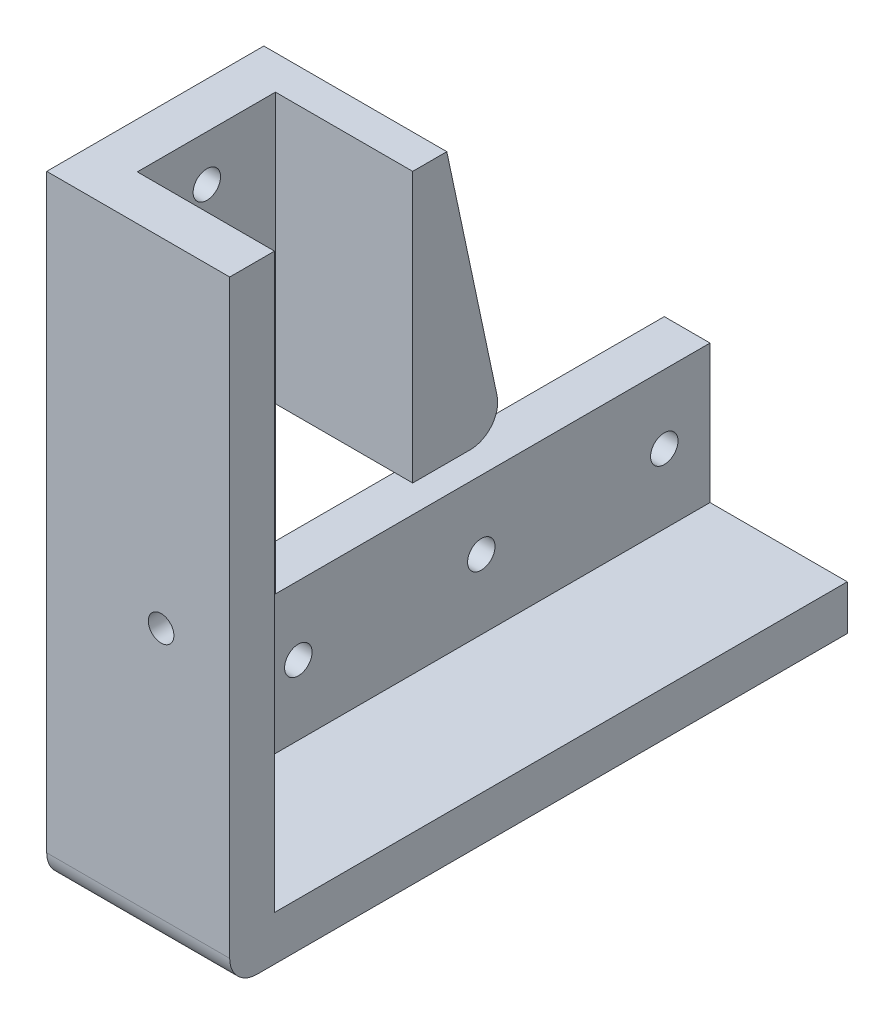
ISO-10303-21;
HEADER;
FILE_DESCRIPTION(('STEP AP214'),'2;1');
FILE_NAME('part.step','',(''),(''),'','','');
FILE_SCHEMA(('AUTOMOTIVE_DESIGN { 1 0 10303 214 1 1 1 1 }'));
ENDSEC;
DATA;
#1=APPLICATION_CONTEXT('core data for automotive mechanical design processes');
#2=APPLICATION_PROTOCOL_DEFINITION('international standard','automotive_design',2000,#1);
#3=PRODUCT_CONTEXT('',#1,'mechanical');
#4=PRODUCT('Part','Part','',(#3));
#5=PRODUCT_RELATED_PRODUCT_CATEGORY('part','',(#4));
#6=PRODUCT_DEFINITION_FORMATION('','',#4);
#7=PRODUCT_DEFINITION_CONTEXT('part definition',#1,'design');
#8=PRODUCT_DEFINITION('design','',#6,#7);
#9=PRODUCT_DEFINITION_SHAPE('','',#8);
#10=(LENGTH_UNIT() NAMED_UNIT(*) SI_UNIT(.MILLI.,.METRE.));
#11=(NAMED_UNIT(*) PLANE_ANGLE_UNIT() SI_UNIT($,.RADIAN.));
#12=(NAMED_UNIT(*) SI_UNIT($,.STERADIAN.) SOLID_ANGLE_UNIT());
#13=UNCERTAINTY_MEASURE_WITH_UNIT(LENGTH_MEASURE(1.E-05),#10,'distance_accuracy_value','');
#14=(GEOMETRIC_REPRESENTATION_CONTEXT(3) GLOBAL_UNCERTAINTY_ASSIGNED_CONTEXT((#13)) GLOBAL_UNIT_ASSIGNED_CONTEXT((#10,
#11,#12)) REPRESENTATION_CONTEXT('',''));
#15=CARTESIAN_POINT('',(0.,0.,0.));
#16=DIRECTION('',(0.,0.,1.));
#17=DIRECTION('',(1.,0.,0.));
#18=AXIS2_PLACEMENT_3D('',#15,#16,#17);
#19=CARTESIAN_POINT('',(20.,0.,0.));
#20=DIRECTION('',(-1.,0.,0.));
#21=DIRECTION('',(0.,0.,1.));
#22=AXIS2_PLACEMENT_3D('',#19,#20,#21);
#23=PLANE('',#22);
#24=DIRECTION('',(0.,0.,-1.));
#25=VECTOR('',#24,1.);
#26=CARTESIAN_POINT('',(20.,25.5,-7.5));
#27=LINE('',#26,#25);
#28=CARTESIAN_POINT('',(20.,25.5,-7.5));
#29=VERTEX_POINT('',#28);
#30=CARTESIAN_POINT('',(20.,25.5,-13.7953085303948));
#31=VERTEX_POINT('',#30);
#32=EDGE_CURVE('E225',#29,#31,#27,.T.);
#33=ORIENTED_EDGE('',*,*,#32,.T.);
#34=CARTESIAN_POINT('',(20.,28.5,-13.7953085303948));
#35=DIRECTION('',(-1.,0.,0.));
#36=DIRECTION('',(0.,0.,1.));
#37=AXIS2_PLACEMENT_3D('',#34,#35,#36);
#38=CIRCLE('',#37,3.);
#39=CARTESIAN_POINT('',(20.,29.1237350724533,-16.7297513325963));
#40=VERTEX_POINT('',#39);
#41=EDGE_CURVE('E287',#31,#40,#38,.F.);
#42=ORIENTED_EDGE('',*,*,#41,.T.);
#43=DIRECTION('',(0.,0.978147600733806,0.20791169081776));
#44=VECTOR('',#43,1.);
#45=CARTESIAN_POINT('',(20.,25.5,-17.5));
#46=LINE('',#45,#44);
#47=CARTESIAN_POINT('',(20.,55.,-11.2295814307343));
#48=VERTEX_POINT('',#47);
#49=EDGE_CURVE('E228',#40,#48,#46,.T.);
#50=ORIENTED_EDGE('',*,*,#49,.T.);
#51=DIRECTION('',(0.,0.,1.));
#52=VECTOR('',#51,1.);
#53=CARTESIAN_POINT('',(20.,55.,-11.2295814307343));
#54=LINE('',#53,#52);
#55=CARTESIAN_POINT('',(20.,55.,-7.5));
#56=VERTEX_POINT('',#55);
#57=EDGE_CURVE('E232',#48,#56,#54,.T.);
#58=ORIENTED_EDGE('',*,*,#57,.T.);
#59=DIRECTION('',(0.,-1.,0.));
#60=VECTOR('',#59,1.);
#61=CARTESIAN_POINT('',(20.,7.5,-7.5));
#62=LINE('',#61,#60);
#63=EDGE_CURVE('E154',#56,#29,#62,.T.);
#64=ORIENTED_EDGE('',*,*,#63,.T.);
#65=EDGE_LOOP('',(#33,#42,#50,#58,#64));
#66=FACE_BOUND('',#65,.T.);
#67=ADVANCED_FACE('F34',(#66),#23,.F.);
#68=DIRECTION('',(0.,-1.,0.));
#69=VECTOR('',#68,1.);
#70=CARTESIAN_POINT('',(20.,-12.5,12.5));
#71=LINE('',#70,#69);
#72=CARTESIAN_POINT('',(20.,55.,12.5));
#73=VERTEX_POINT('',#72);
#74=CARTESIAN_POINT('',(20.,-9.5,12.5));
#75=VERTEX_POINT('',#74);
#76=EDGE_CURVE('E234',#73,#75,#71,.T.);
#77=ORIENTED_EDGE('',*,*,#76,.T.);
#78=CARTESIAN_POINT('',(20.,-9.5,9.5));
#79=DIRECTION('',(-1.,0.,0.));
#80=DIRECTION('',(0.,0.,1.));
#81=AXIS2_PLACEMENT_3D('',#78,#79,#80);
#82=CIRCLE('',#81,3.);
#83=CARTESIAN_POINT('',(20.,-12.5,9.5));
#84=VERTEX_POINT('',#83);
#85=EDGE_CURVE('E11',#75,#84,#82,.F.);
#86=ORIENTED_EDGE('',*,*,#85,.T.);
#87=DIRECTION('',(0.,0.,-1.));
#88=VECTOR('',#87,1.);
#89=CARTESIAN_POINT('',(20.,-12.5,12.5));
#90=LINE('',#89,#88);
#91=CARTESIAN_POINT('',(20.,-12.5,-55.));
#92=VERTEX_POINT('',#91);
#93=EDGE_CURVE('E236',#84,#92,#90,.T.);
#94=ORIENTED_EDGE('',*,*,#93,.T.);
#95=DIRECTION('',(0.,1.,0.));
#96=VECTOR('',#95,1.);
#97=CARTESIAN_POINT('',(20.,-12.5,-55.));
#98=LINE('',#97,#96);
#99=CARTESIAN_POINT('',(20.,-7.6,-55.));
#100=VERTEX_POINT('',#99);
#101=EDGE_CURVE('E238',#92,#100,#98,.T.);
#102=ORIENTED_EDGE('',*,*,#101,.T.);
#103=DIRECTION('',(0.,0.,1.));
#104=VECTOR('',#103,1.);
#105=CARTESIAN_POINT('',(20.,-7.59999999999999,7.60000000000001));
#106=LINE('',#105,#104);
#107=CARTESIAN_POINT('',(20.,-7.59999999999999,7.60000000000001));
#108=VERTEX_POINT('',#107);
#109=EDGE_CURVE('E167',#100,#108,#106,.T.);
#110=ORIENTED_EDGE('',*,*,#109,.T.);
#111=DIRECTION('',(0.,1.,0.));
#112=VECTOR('',#111,1.);
#113=CARTESIAN_POINT('',(20.,55.,7.6));
#114=LINE('',#113,#112);
#115=CARTESIAN_POINT('',(20.,55.,7.6));
#116=VERTEX_POINT('',#115);
#117=EDGE_CURVE('E164',#108,#116,#114,.T.);
#118=ORIENTED_EDGE('',*,*,#117,.T.);
#119=EDGE_CURVE('E231',#116,#73,#54,.T.);
#120=ORIENTED_EDGE('',*,*,#119,.T.);
#121=EDGE_LOOP('',(#77,#86,#94,#102,#110,#118,#120));
#122=FACE_BOUND('',#121,.T.);
#123=ADVANCED_FACE('F309',(#122),#23,.F.);
#124=CARTESIAN_POINT('',(20.,7.5,-7.5));
#125=DIRECTION('',(0.,0.,1.));
#126=DIRECTION('',(1.,0.,0.));
#127=AXIS2_PLACEMENT_3D('',#124,#125,#126);
#128=PLANE('',#127);
#129=DIRECTION('',(0.,-1.,0.));
#130=VECTOR('',#129,1.);
#131=CARTESIAN_POINT('',(5.,7.5,-7.5));
#132=LINE('',#131,#130);
#133=CARTESIAN_POINT('',(5.,25.5,-7.5));
#134=VERTEX_POINT('',#133);
#135=CARTESIAN_POINT('',(5.,7.5,-7.5));
#136=VERTEX_POINT('',#135);
#137=EDGE_CURVE('E145',#134,#136,#132,.T.);
#138=ORIENTED_EDGE('',*,*,#137,.T.);
#139=DIRECTION('',(-1.,0.,0.));
#140=VECTOR('',#139,1.);
#141=CARTESIAN_POINT('',(20.,7.5,-7.5));
#142=LINE('',#141,#140);
#143=CARTESIAN_POINT('',(0.,7.5,-7.5));
#144=VERTEX_POINT('',#143);
#145=EDGE_CURVE('E241',#136,#144,#142,.T.);
#146=ORIENTED_EDGE('',*,*,#145,.T.);
#147=DIRECTION('',(0.,1.,0.));
#148=VECTOR('',#147,1.);
#149=CARTESIAN_POINT('',(0.,7.5,-7.5));
#150=LINE('',#149,#148);
#151=CARTESIAN_POINT('',(0.,25.5,-7.5));
#152=VERTEX_POINT('',#151);
#153=EDGE_CURVE('E224',#144,#152,#150,.T.);
#154=ORIENTED_EDGE('',*,*,#153,.T.);
#155=DIRECTION('',(-1.,0.,0.));
#156=VECTOR('',#155,1.);
#157=CARTESIAN_POINT('',(20.,25.5,-7.5));
#158=LINE('',#157,#156);
#159=EDGE_CURVE('E272',#134,#152,#158,.T.);
#160=ORIENTED_EDGE('',*,*,#159,.F.);
#161=EDGE_LOOP('',(#138,#146,#154,#160));
#162=FACE_BOUND('',#161,.T.);
#163=ADVANCED_FACE('F321',(#162),#128,.F.);
#164=CARTESIAN_POINT('',(20.,55.,-11.2295814307343));
#165=DIRECTION('',(0.,-1.,0.));
#166=DIRECTION('',(0.,0.,-1.));
#167=AXIS2_PLACEMENT_3D('',#164,#165,#166);
#168=PLANE('',#167);
#169=DIRECTION('',(1.,0.,0.));
#170=VECTOR('',#169,1.);
#171=CARTESIAN_POINT('',(5.,55.,-7.5));
#172=LINE('',#171,#170);
#173=CARTESIAN_POINT('',(5.,55.,-7.5));
#174=VERTEX_POINT('',#173);
#175=EDGE_CURVE('E151',#174,#56,#172,.T.);
#176=ORIENTED_EDGE('',*,*,#175,.T.);
#177=ORIENTED_EDGE('',*,*,#57,.F.);
#178=DIRECTION('',(-1.,0.,0.));
#179=VECTOR('',#178,1.);
#180=CARTESIAN_POINT('',(20.,55.,-11.2295814307343));
#181=LINE('',#180,#179);
#182=CARTESIAN_POINT('',(0.,55.,-11.2295814307343));
#183=VERTEX_POINT('',#182);
#184=EDGE_CURVE('E269',#48,#183,#181,.T.);
#185=ORIENTED_EDGE('',*,*,#184,.T.);
#186=DIRECTION('',(0.,0.,1.));
#187=VECTOR('',#186,1.);
#188=CARTESIAN_POINT('',(0.,55.,-11.2295814307343));
#189=LINE('',#188,#187);
#190=CARTESIAN_POINT('',(0.,55.,12.5));
#191=VERTEX_POINT('',#190);
#192=EDGE_CURVE('E249',#183,#191,#189,.T.);
#193=ORIENTED_EDGE('',*,*,#192,.T.);
#194=DIRECTION('',(-1.,0.,0.));
#195=VECTOR('',#194,1.);
#196=CARTESIAN_POINT('',(20.,55.,12.5));
#197=LINE('',#196,#195);
#198=EDGE_CURVE('E266',#73,#191,#197,.T.);
#199=ORIENTED_EDGE('',*,*,#198,.F.);
#200=ORIENTED_EDGE('',*,*,#119,.F.);
#201=DIRECTION('',(1.,0.,0.));
#202=VECTOR('',#201,1.);
#203=CARTESIAN_POINT('',(5.,55.,7.6));
#204=LINE('',#203,#202);
#205=CARTESIAN_POINT('',(5.,55.,7.6));
#206=VERTEX_POINT('',#205);
#207=EDGE_CURVE('E163',#206,#116,#204,.T.);
#208=ORIENTED_EDGE('',*,*,#207,.F.);
#209=DIRECTION('',(0.,0.,-1.));
#210=VECTOR('',#209,1.);
#211=CARTESIAN_POINT('',(5.,55.,-7.5));
#212=LINE('',#211,#210);
#213=EDGE_CURVE('E142',#206,#174,#212,.T.);
#214=ORIENTED_EDGE('',*,*,#213,.T.);
#215=EDGE_LOOP('',(#176,#177,#185,#193,#199,#200,#208,#214));
#216=FACE_BOUND('',#215,.T.);
#217=ADVANCED_FACE('F161',(#216),#168,.F.);
#218=CARTESIAN_POINT('',(20.,-12.5,-55.));
#219=DIRECTION('',(0.,0.,1.));
#220=DIRECTION('',(1.,0.,0.));
#221=AXIS2_PLACEMENT_3D('',#218,#219,#220);
#222=PLANE('',#221);
#223=DIRECTION('',(1.,0.,0.));
#224=VECTOR('',#223,1.);
#225=CARTESIAN_POINT('',(5.,-7.6,-55.));
#226=LINE('',#225,#224);
#227=CARTESIAN_POINT('',(5.,-7.6,-55.));
#228=VERTEX_POINT('',#227);
#229=EDGE_CURVE('E159',#228,#100,#226,.T.);
#230=ORIENTED_EDGE('',*,*,#229,.T.);
#231=ORIENTED_EDGE('',*,*,#101,.F.);
#232=DIRECTION('',(-1.,0.,0.));
#233=VECTOR('',#232,1.);
#234=CARTESIAN_POINT('',(20.,-12.5,-55.));
#235=LINE('',#234,#233);
#236=CARTESIAN_POINT('',(0.,-12.5,-55.));
#237=VERTEX_POINT('',#236);
#238=EDGE_CURVE('E263',#92,#237,#235,.T.);
#239=ORIENTED_EDGE('',*,*,#238,.T.);
#240=DIRECTION('',(0.,1.,0.));
#241=VECTOR('',#240,1.);
#242=CARTESIAN_POINT('',(0.,-12.5,-55.));
#243=LINE('',#242,#241);
#244=CARTESIAN_POINT('',(0.,7.5,-55.));
#245=VERTEX_POINT('',#244);
#246=EDGE_CURVE('E255',#237,#245,#243,.T.);
#247=ORIENTED_EDGE('',*,*,#246,.T.);
#248=DIRECTION('',(-1.,0.,0.));
#249=VECTOR('',#248,1.);
#250=CARTESIAN_POINT('',(20.,7.5,-55.));
#251=LINE('',#250,#249);
#252=CARTESIAN_POINT('',(5.,7.5,-55.));
#253=VERTEX_POINT('',#252);
#254=EDGE_CURVE('E261',#253,#245,#251,.T.);
#255=ORIENTED_EDGE('',*,*,#254,.F.);
#256=DIRECTION('',(0.,-1.,0.));
#257=VECTOR('',#256,1.);
#258=CARTESIAN_POINT('',(5.,-7.6,-55.));
#259=LINE('',#258,#257);
#260=EDGE_CURVE('E175',#253,#228,#259,.T.);
#261=ORIENTED_EDGE('',*,*,#260,.T.);
#262=EDGE_LOOP('',(#230,#231,#239,#247,#255,#261));
#263=FACE_BOUND('',#262,.T.);
#264=ADVANCED_FACE('F307',(#263),#222,.F.);
#265=CARTESIAN_POINT('',(20.,7.5,-55.));
#266=DIRECTION('',(0.,-1.,0.));
#267=DIRECTION('',(0.,0.,-1.));
#268=AXIS2_PLACEMENT_3D('',#265,#266,#267);
#269=PLANE('',#268);
#270=DIRECTION('',(0.,0.,-1.));
#271=VECTOR('',#270,1.);
#272=CARTESIAN_POINT('',(5.,7.5,-55.));
#273=LINE('',#272,#271);
#274=EDGE_CURVE('E148',#136,#253,#273,.T.);
#275=ORIENTED_EDGE('',*,*,#274,.T.);
#276=ORIENTED_EDGE('',*,*,#254,.T.);
#277=DIRECTION('',(0.,0.,1.));
#278=VECTOR('',#277,1.);
#279=CARTESIAN_POINT('',(0.,7.5,-55.));
#280=LINE('',#279,#278);
#281=EDGE_CURVE('E229',#245,#144,#280,.T.);
#282=ORIENTED_EDGE('',*,*,#281,.T.);
#283=ORIENTED_EDGE('',*,*,#145,.F.);
#284=EDGE_LOOP('',(#275,#276,#282,#283));
#285=FACE_BOUND('',#284,.T.);
#286=ADVANCED_FACE('F319',(#285),#269,.F.);
#287=CARTESIAN_POINT('',(20.,10.,0.));
#288=DIRECTION('',(-1.,0.,0.));
#289=DIRECTION('',(0.,0.,1.));
#290=AXIS2_PLACEMENT_3D('',#287,#288,#289);
#291=CYLINDRICAL_SURFACE('',#290,1.5);
#292=CARTESIAN_POINT('',(0.,10.,0.));
#293=DIRECTION('',(1.,0.,0.));
#294=DIRECTION('',(0.,0.,-1.));
#295=AXIS2_PLACEMENT_3D('',#292,#293,#294);
#296=CIRCLE('',#295,1.5);
#297=CARTESIAN_POINT('',(0.,10.,-1.5));
#298=VERTEX_POINT('',#297);
#299=EDGE_CURVE('E221',#298,#298,#296,.T.);
#300=ORIENTED_EDGE('',*,*,#299,.F.);
#301=EDGE_LOOP('',(#300));
#302=FACE_BOUND('',#301,.T.);
#303=CARTESIAN_POINT('',(5.,10.,0.));
#304=DIRECTION('',(1.,0.,0.));
#305=DIRECTION('',(0.,0.,-1.));
#306=AXIS2_PLACEMENT_3D('',#303,#304,#305);
#307=CIRCLE('',#306,1.5);
#308=CARTESIAN_POINT('',(5.,10.,-1.5));
#309=VERTEX_POINT('',#308);
#310=EDGE_CURVE('E203',#309,#309,#307,.T.);
#311=ORIENTED_EDGE('',*,*,#310,.T.);
#312=EDGE_LOOP('',(#311));
#313=FACE_BOUND('',#312,.T.);
#314=ADVANCED_FACE('F348',(#302,#313),#291,.F.);
#315=CARTESIAN_POINT('',(20.,30.,0.));
#316=DIRECTION('',(-1.,0.,0.));
#317=DIRECTION('',(0.,0.,1.));
#318=AXIS2_PLACEMENT_3D('',#315,#316,#317);
#319=CYLINDRICAL_SURFACE('',#318,1.5);
#320=CARTESIAN_POINT('',(0.,30.,0.));
#321=DIRECTION('',(1.,0.,0.));
#322=DIRECTION('',(0.,0.,-1.));
#323=AXIS2_PLACEMENT_3D('',#320,#321,#322);
#324=CIRCLE('',#323,1.5);
#325=CARTESIAN_POINT('',(0.,30.,-1.5));
#326=VERTEX_POINT('',#325);
#327=EDGE_CURVE('E218',#326,#326,#324,.T.);
#328=ORIENTED_EDGE('',*,*,#327,.F.);
#329=EDGE_LOOP('',(#328));
#330=FACE_BOUND('',#329,.T.);
#331=CARTESIAN_POINT('',(5.,30.,0.));
#332=DIRECTION('',(1.,0.,0.));
#333=DIRECTION('',(0.,0.,-1.));
#334=AXIS2_PLACEMENT_3D('',#331,#332,#333);
#335=CIRCLE('',#334,1.5);
#336=CARTESIAN_POINT('',(5.,30.,-1.5));
#337=VERTEX_POINT('',#336);
#338=EDGE_CURVE('E200',#337,#337,#335,.T.);
#339=ORIENTED_EDGE('',*,*,#338,.T.);
#340=EDGE_LOOP('',(#339));
#341=FACE_BOUND('',#340,.T.);
#342=ADVANCED_FACE('F393',(#330,#341),#319,.F.);
#343=CARTESIAN_POINT('',(20.,0.,-10.));
#344=DIRECTION('',(-1.,0.,0.));
#345=DIRECTION('',(0.,0.,1.));
#346=AXIS2_PLACEMENT_3D('',#343,#344,#345);
#347=CYLINDRICAL_SURFACE('',#346,1.5);
#348=CARTESIAN_POINT('',(0.,0.,-10.));
#349=DIRECTION('',(1.,0.,0.));
#350=DIRECTION('',(0.,0.,-1.));
#351=AXIS2_PLACEMENT_3D('',#348,#349,#350);
#352=CIRCLE('',#351,1.5);
#353=CARTESIAN_POINT('',(0.,0.,-11.5));
#354=VERTEX_POINT('',#353);
#355=EDGE_CURVE('E215',#354,#354,#352,.T.);
#356=ORIENTED_EDGE('',*,*,#355,.F.);
#357=EDGE_LOOP('',(#356));
#358=FACE_BOUND('',#357,.T.);
#359=CARTESIAN_POINT('',(5.,0.,-10.));
#360=DIRECTION('',(1.,0.,0.));
#361=DIRECTION('',(0.,0.,-1.));
#362=AXIS2_PLACEMENT_3D('',#359,#360,#361);
#363=CIRCLE('',#362,1.5);
#364=CARTESIAN_POINT('',(5.,0.,-11.5));
#365=VERTEX_POINT('',#364);
#366=EDGE_CURVE('E197',#365,#365,#363,.T.);
#367=ORIENTED_EDGE('',*,*,#366,.T.);
#368=EDGE_LOOP('',(#367));
#369=FACE_BOUND('',#368,.T.);
#370=ADVANCED_FACE('F400',(#358,#369),#347,.F.);
#371=CARTESIAN_POINT('',(20.,0.,-30.));
#372=DIRECTION('',(-1.,0.,0.));
#373=DIRECTION('',(0.,0.,1.));
#374=AXIS2_PLACEMENT_3D('',#371,#372,#373);
#375=CYLINDRICAL_SURFACE('',#374,1.5);
#376=CARTESIAN_POINT('',(0.,0.,-30.));
#377=DIRECTION('',(1.,0.,0.));
#378=DIRECTION('',(0.,0.,-1.));
#379=AXIS2_PLACEMENT_3D('',#376,#377,#378);
#380=CIRCLE('',#379,1.5);
#381=CARTESIAN_POINT('',(0.,0.,-31.5));
#382=VERTEX_POINT('',#381);
#383=EDGE_CURVE('E212',#382,#382,#380,.T.);
#384=ORIENTED_EDGE('',*,*,#383,.F.);
#385=EDGE_LOOP('',(#384));
#386=FACE_BOUND('',#385,.T.);
#387=CARTESIAN_POINT('',(5.,0.,-30.));
#388=DIRECTION('',(1.,0.,0.));
#389=DIRECTION('',(0.,0.,-1.));
#390=AXIS2_PLACEMENT_3D('',#387,#388,#389);
#391=CIRCLE('',#390,1.5);
#392=CARTESIAN_POINT('',(5.,0.,-31.5));
#393=VERTEX_POINT('',#392);
#394=EDGE_CURVE('E194',#393,#393,#391,.T.);
#395=ORIENTED_EDGE('',*,*,#394,.T.);
#396=EDGE_LOOP('',(#395));
#397=FACE_BOUND('',#396,.T.);
#398=ADVANCED_FACE('F407',(#386,#397),#375,.F.);
#399=CARTESIAN_POINT('',(20.,0.,-50.));
#400=DIRECTION('',(-1.,0.,0.));
#401=DIRECTION('',(0.,0.,1.));
#402=AXIS2_PLACEMENT_3D('',#399,#400,#401);
#403=CYLINDRICAL_SURFACE('',#402,1.5);
#404=CARTESIAN_POINT('',(0.,0.,-50.));
#405=DIRECTION('',(1.,0.,0.));
#406=DIRECTION('',(0.,0.,-1.));
#407=AXIS2_PLACEMENT_3D('',#404,#405,#406);
#408=CIRCLE('',#407,1.5);
#409=CARTESIAN_POINT('',(0.,0.,-51.5));
#410=VERTEX_POINT('',#409);
#411=EDGE_CURVE('E209',#410,#410,#408,.T.);
#412=ORIENTED_EDGE('',*,*,#411,.F.);
#413=EDGE_LOOP('',(#412));
#414=FACE_BOUND('',#413,.T.);
#415=CARTESIAN_POINT('',(5.,0.,-50.));
#416=DIRECTION('',(1.,0.,0.));
#417=DIRECTION('',(0.,0.,-1.));
#418=AXIS2_PLACEMENT_3D('',#415,#416,#417);
#419=CIRCLE('',#418,1.5);
#420=CARTESIAN_POINT('',(5.,0.,-51.5));
#421=VERTEX_POINT('',#420);
#422=EDGE_CURVE('E191',#421,#421,#419,.T.);
#423=ORIENTED_EDGE('',*,*,#422,.T.);
#424=EDGE_LOOP('',(#423));
#425=FACE_BOUND('',#424,.T.);
#426=ADVANCED_FACE('F415',(#414,#425),#403,.F.);
#427=CARTESIAN_POINT('',(20.,50.,0.));
#428=DIRECTION('',(-1.,0.,0.));
#429=DIRECTION('',(0.,0.,1.));
#430=AXIS2_PLACEMENT_3D('',#427,#428,#429);
#431=CYLINDRICAL_SURFACE('',#430,1.5);
#432=CARTESIAN_POINT('',(0.,50.,0.));
#433=DIRECTION('',(1.,0.,0.));
#434=DIRECTION('',(0.,0.,-1.));
#435=AXIS2_PLACEMENT_3D('',#432,#433,#434);
#436=CIRCLE('',#435,1.5);
#437=CARTESIAN_POINT('',(0.,50.,-1.5));
#438=VERTEX_POINT('',#437);
#439=EDGE_CURVE('E206',#438,#438,#436,.T.);
#440=ORIENTED_EDGE('',*,*,#439,.F.);
#441=EDGE_LOOP('',(#440));
#442=FACE_BOUND('',#441,.T.);
#443=CARTESIAN_POINT('',(5.,50.,0.));
#444=DIRECTION('',(1.,0.,0.));
#445=DIRECTION('',(0.,0.,-1.));
#446=AXIS2_PLACEMENT_3D('',#443,#444,#445);
#447=CIRCLE('',#446,1.5);
#448=CARTESIAN_POINT('',(5.,50.,-1.5));
#449=VERTEX_POINT('',#448);
#450=EDGE_CURVE('E158',#449,#449,#447,.T.);
#451=ORIENTED_EDGE('',*,*,#450,.T.);
#452=EDGE_LOOP('',(#451));
#453=FACE_BOUND('',#452,.T.);
#454=ADVANCED_FACE('F352',(#442,#453),#431,.F.);
#455=CARTESIAN_POINT('',(0.,0.,0.));
#456=DIRECTION('',(-1.,0.,0.));
#457=DIRECTION('',(0.,0.,1.));
#458=AXIS2_PLACEMENT_3D('',#455,#456,#457);
#459=PLANE('',#458);
#460=ORIENTED_EDGE('',*,*,#411,.T.);
#461=EDGE_LOOP('',(#460));
#462=FACE_BOUND('',#461,.T.);
#463=ORIENTED_EDGE('',*,*,#355,.T.);
#464=EDGE_LOOP('',(#463));
#465=FACE_BOUND('',#464,.T.);
#466=ORIENTED_EDGE('',*,*,#299,.T.);
#467=EDGE_LOOP('',(#466));
#468=FACE_BOUND('',#467,.T.);
#469=DIRECTION('',(0.,0.978147600733806,0.20791169081776));
#470=VECTOR('',#469,1.);
#471=CARTESIAN_POINT('',(0.,25.5,-17.5));
#472=LINE('',#471,#470);
#473=CARTESIAN_POINT('',(0.,29.1237350724533,-16.7297513325963));
#474=VERTEX_POINT('',#473);
#475=EDGE_CURVE('E247',#474,#183,#472,.T.);
#476=ORIENTED_EDGE('',*,*,#475,.F.);
#477=CARTESIAN_POINT('',(0.,28.5,-13.7953085303948));
#478=DIRECTION('',(-1.,0.,0.));
#479=DIRECTION('',(0.,0.,1.));
#480=AXIS2_PLACEMENT_3D('',#477,#478,#479);
#481=CIRCLE('',#480,3.);
#482=CARTESIAN_POINT('',(0.,25.5,-13.7953085303948));
#483=VERTEX_POINT('',#482);
#484=EDGE_CURVE('E283',#474,#483,#481,.T.);
#485=ORIENTED_EDGE('',*,*,#484,.T.);
#486=DIRECTION('',(0.,0.,-1.));
#487=VECTOR('',#486,1.);
#488=CARTESIAN_POINT('',(0.,25.5,-7.5));
#489=LINE('',#488,#487);
#490=EDGE_CURVE('E244',#152,#483,#489,.T.);
#491=ORIENTED_EDGE('',*,*,#490,.F.);
#492=ORIENTED_EDGE('',*,*,#153,.F.);
#493=ORIENTED_EDGE('',*,*,#281,.F.);
#494=ORIENTED_EDGE('',*,*,#246,.F.);
#495=DIRECTION('',(0.,0.,-1.));
#496=VECTOR('',#495,1.);
#497=CARTESIAN_POINT('',(0.,-12.5,12.5));
#498=LINE('',#497,#496);
#499=CARTESIAN_POINT('',(0.,-12.5,9.5));
#500=VERTEX_POINT('',#499);
#501=EDGE_CURVE('E253',#500,#237,#498,.T.);
#502=ORIENTED_EDGE('',*,*,#501,.F.);
#503=CARTESIAN_POINT('',(0.,-9.5,9.5));
#504=DIRECTION('',(-1.,0.,0.));
#505=DIRECTION('',(0.,0.,1.));
#506=AXIS2_PLACEMENT_3D('',#503,#504,#505);
#507=CIRCLE('',#506,3.);
#508=CARTESIAN_POINT('',(0.,-9.5,12.5));
#509=VERTEX_POINT('',#508);
#510=EDGE_CURVE('E281',#500,#509,#507,.T.);
#511=ORIENTED_EDGE('',*,*,#510,.T.);
#512=DIRECTION('',(0.,-1.,0.));
#513=VECTOR('',#512,1.);
#514=CARTESIAN_POINT('',(0.,-12.5,12.5));
#515=LINE('',#514,#513);
#516=EDGE_CURVE('E251',#191,#509,#515,.T.);
#517=ORIENTED_EDGE('',*,*,#516,.F.);
#518=ORIENTED_EDGE('',*,*,#192,.F.);
#519=EDGE_LOOP('',(#476,#485,#491,#492,#493,#494,#502,#511,#517,#518));
#520=FACE_BOUND('',#519,.T.);
#521=ORIENTED_EDGE('',*,*,#327,.T.);
#522=EDGE_LOOP('',(#521));
#523=FACE_BOUND('',#522,.T.);
#524=ORIENTED_EDGE('',*,*,#383,.T.);
#525=EDGE_LOOP('',(#524));
#526=FACE_BOUND('',#525,.T.);
#527=ORIENTED_EDGE('',*,*,#439,.T.);
#528=EDGE_LOOP('',(#527));
#529=FACE_BOUND('',#528,.T.);
#530=ADVANCED_FACE('F300',(#462,#465,#468,#520,#523,#526,#529),#459,.T.);
#531=CARTESIAN_POINT('',(20.,25.5,-7.5));
#532=DIRECTION('',(0.,1.,0.));
#533=DIRECTION('',(0.,0.,1.));
#534=AXIS2_PLACEMENT_3D('',#531,#532,#533);
#535=PLANE('',#534);
#536=ORIENTED_EDGE('',*,*,#490,.T.);
#537=DIRECTION('',(-1.,0.,0.));
#538=VECTOR('',#537,1.);
#539=CARTESIAN_POINT('',(20.,25.5,-13.7953085303948));
#540=LINE('',#539,#538);
#541=EDGE_CURVE('E285',#483,#31,#540,.F.);
#542=ORIENTED_EDGE('',*,*,#541,.T.);
#543=ORIENTED_EDGE('',*,*,#32,.F.);
#544=EDGE_CURVE('E273',#29,#134,#158,.T.);
#545=ORIENTED_EDGE('',*,*,#544,.T.);
#546=ORIENTED_EDGE('',*,*,#159,.T.);
#547=EDGE_LOOP('',(#536,#542,#543,#545,#546));
#548=FACE_BOUND('',#547,.T.);
#549=ADVANCED_FACE('F325',(#548),#535,.F.);
#550=CARTESIAN_POINT('',(20.,25.5,-17.5));
#551=DIRECTION('',(0.,-0.20791169081776,0.978147600733806));
#552=DIRECTION('',(0.,-0.978147600733806,-0.20791169081776));
#553=AXIS2_PLACEMENT_3D('',#550,#551,#552);
#554=PLANE('',#553);
#555=ORIENTED_EDGE('',*,*,#49,.F.);
#556=DIRECTION('',(-1.,0.,0.));
#557=VECTOR('',#556,1.);
#558=CARTESIAN_POINT('',(20.,29.1237350724533,-16.7297513325963));
#559=LINE('',#558,#557);
#560=EDGE_CURVE('E276',#40,#474,#559,.T.);
#561=ORIENTED_EDGE('',*,*,#560,.T.);
#562=ORIENTED_EDGE('',*,*,#475,.T.);
#563=ORIENTED_EDGE('',*,*,#184,.F.);
#564=EDGE_LOOP('',(#555,#561,#562,#563));
#565=FACE_BOUND('',#564,.T.);
#566=ADVANCED_FACE('F362',(#565),#554,.F.);
#567=CARTESIAN_POINT('',(20.,-12.5,12.5));
#568=DIRECTION('',(0.,0.,-1.));
#569=DIRECTION('',(-1.,0.,0.));
#570=AXIS2_PLACEMENT_3D('',#567,#568,#569);
#571=PLANE('',#570);
#572=CARTESIAN_POINT('',(12.5,18.,12.5));
#573=DIRECTION('',(0.,0.,-1.));
#574=DIRECTION('',(0.,1.,0.));
#575=AXIS2_PLACEMENT_3D('',#572,#573,#574);
#576=CIRCLE('',#575,1.4);
#577=CARTESIAN_POINT('',(12.5,19.4,12.5));
#578=VERTEX_POINT('',#577);
#579=EDGE_CURVE('E183',#578,#578,#576,.T.);
#580=ORIENTED_EDGE('',*,*,#579,.T.);
#581=EDGE_LOOP('',(#580));
#582=FACE_BOUND('',#581,.T.);
#583=ORIENTED_EDGE('',*,*,#516,.T.);
#584=DIRECTION('',(-1.,0.,0.));
#585=VECTOR('',#584,1.);
#586=CARTESIAN_POINT('',(20.,-9.5,12.5));
#587=LINE('',#586,#585);
#588=EDGE_CURVE('E42',#509,#75,#587,.F.);
#589=ORIENTED_EDGE('',*,*,#588,.T.);
#590=ORIENTED_EDGE('',*,*,#76,.F.);
#591=ORIENTED_EDGE('',*,*,#198,.T.);
#592=EDGE_LOOP('',(#583,#589,#590,#591));
#593=FACE_BOUND('',#592,.T.);
#594=ADVANCED_FACE('F333',(#582,#593),#571,.F.);
#595=CARTESIAN_POINT('',(20.,-12.5,12.5));
#596=DIRECTION('',(0.,1.,0.));
#597=DIRECTION('',(0.,0.,1.));
#598=AXIS2_PLACEMENT_3D('',#595,#596,#597);
#599=PLANE('',#598);
#600=ORIENTED_EDGE('',*,*,#93,.F.);
#601=DIRECTION('',(-1.,0.,0.));
#602=VECTOR('',#601,1.);
#603=CARTESIAN_POINT('',(20.,-12.5,9.5));
#604=LINE('',#603,#602);
#605=EDGE_CURVE('E289',#84,#500,#604,.T.);
#606=ORIENTED_EDGE('',*,*,#605,.T.);
#607=ORIENTED_EDGE('',*,*,#501,.T.);
#608=ORIENTED_EDGE('',*,*,#238,.F.);
#609=EDGE_LOOP('',(#600,#606,#607,#608));
#610=FACE_BOUND('',#609,.T.);
#611=ADVANCED_FACE('F294',(#610),#599,.F.);
#612=CARTESIAN_POINT('',(5.,7.5,-7.5));
#613=DIRECTION('',(0.,0.,1.));
#614=DIRECTION('',(1.,0.,0.));
#615=AXIS2_PLACEMENT_3D('',#612,#613,#614);
#616=PLANE('',#615);
#617=ORIENTED_EDGE('',*,*,#544,.F.);
#618=ORIENTED_EDGE('',*,*,#63,.F.);
#619=ORIENTED_EDGE('',*,*,#175,.F.);
#620=EDGE_CURVE('E137',#174,#134,#132,.T.);
#621=ORIENTED_EDGE('',*,*,#620,.T.);
#622=EDGE_LOOP('',(#617,#618,#619,#621));
#623=FACE_BOUND('',#622,.T.);
#624=ADVANCED_FACE('F152',(#623),#616,.T.);
#625=CARTESIAN_POINT('',(5.,-7.59999999999999,7.60000000000001));
#626=DIRECTION('',(0.,1.,0.));
#627=DIRECTION('',(0.,0.,1.));
#628=AXIS2_PLACEMENT_3D('',#625,#626,#627);
#629=PLANE('',#628);
#630=ORIENTED_EDGE('',*,*,#109,.F.);
#631=ORIENTED_EDGE('',*,*,#229,.F.);
#632=DIRECTION('',(0.,0.,1.));
#633=VECTOR('',#632,1.);
#634=CARTESIAN_POINT('',(5.,-7.59999999999999,7.60000000000001));
#635=LINE('',#634,#633);
#636=CARTESIAN_POINT('',(5.,-7.59999999999999,7.60000000000001));
#637=VERTEX_POINT('',#636);
#638=EDGE_CURVE('E178',#228,#637,#635,.T.);
#639=ORIENTED_EDGE('',*,*,#638,.T.);
#640=DIRECTION('',(1.,0.,0.));
#641=VECTOR('',#640,1.);
#642=CARTESIAN_POINT('',(5.,-7.59999999999999,7.60000000000001));
#643=LINE('',#642,#641);
#644=EDGE_CURVE('E187',#637,#108,#643,.T.);
#645=ORIENTED_EDGE('',*,*,#644,.T.);
#646=EDGE_LOOP('',(#630,#631,#639,#645));
#647=FACE_BOUND('',#646,.T.);
#648=ADVANCED_FACE('F312',(#647),#629,.T.);
#649=CARTESIAN_POINT('',(5.,55.,7.6));
#650=DIRECTION('',(0.,0.,-1.));
#651=DIRECTION('',(0.,1.,0.));
#652=AXIS2_PLACEMENT_3D('',#649,#650,#651);
#653=PLANE('',#652);
#654=CARTESIAN_POINT('',(12.5,18.,7.6));
#655=DIRECTION('',(0.,0.,-1.));
#656=DIRECTION('',(0.,1.,0.));
#657=AXIS2_PLACEMENT_3D('',#654,#655,#656);
#658=CIRCLE('',#657,1.4);
#659=CARTESIAN_POINT('',(12.5,19.4,7.6));
#660=VERTEX_POINT('',#659);
#661=EDGE_CURVE('E170',#660,#660,#658,.T.);
#662=ORIENTED_EDGE('',*,*,#661,.F.);
#663=EDGE_LOOP('',(#662));
#664=FACE_BOUND('',#663,.T.);
#665=ORIENTED_EDGE('',*,*,#117,.F.);
#666=ORIENTED_EDGE('',*,*,#644,.F.);
#667=DIRECTION('',(0.,1.,0.));
#668=VECTOR('',#667,1.);
#669=CARTESIAN_POINT('',(5.,55.,7.6));
#670=LINE('',#669,#668);
#671=EDGE_CURVE('E180',#637,#206,#670,.T.);
#672=ORIENTED_EDGE('',*,*,#671,.T.);
#673=ORIENTED_EDGE('',*,*,#207,.T.);
#674=EDGE_LOOP('',(#665,#666,#672,#673));
#675=FACE_BOUND('',#674,.T.);
#676=ADVANCED_FACE('F316',(#664,#675),#653,.T.);
#677=CARTESIAN_POINT('',(5.,0.,0.));
#678=DIRECTION('',(1.,0.,0.));
#679=DIRECTION('',(0.,0.,-1.));
#680=AXIS2_PLACEMENT_3D('',#677,#678,#679);
#681=PLANE('',#680);
#682=ORIENTED_EDGE('',*,*,#310,.F.);
#683=EDGE_LOOP('',(#682));
#684=FACE_BOUND('',#683,.T.);
#685=ORIENTED_EDGE('',*,*,#338,.F.);
#686=EDGE_LOOP('',(#685));
#687=FACE_BOUND('',#686,.T.);
#688=ORIENTED_EDGE('',*,*,#366,.F.);
#689=EDGE_LOOP('',(#688));
#690=FACE_BOUND('',#689,.T.);
#691=ORIENTED_EDGE('',*,*,#394,.F.);
#692=EDGE_LOOP('',(#691));
#693=FACE_BOUND('',#692,.T.);
#694=ORIENTED_EDGE('',*,*,#422,.F.);
#695=EDGE_LOOP('',(#694));
#696=FACE_BOUND('',#695,.T.);
#697=ORIENTED_EDGE('',*,*,#450,.F.);
#698=EDGE_LOOP('',(#697));
#699=FACE_BOUND('',#698,.T.);
#700=ORIENTED_EDGE('',*,*,#213,.F.);
#701=ORIENTED_EDGE('',*,*,#671,.F.);
#702=ORIENTED_EDGE('',*,*,#638,.F.);
#703=ORIENTED_EDGE('',*,*,#260,.F.);
#704=ORIENTED_EDGE('',*,*,#274,.F.);
#705=ORIENTED_EDGE('',*,*,#137,.F.);
#706=ORIENTED_EDGE('',*,*,#620,.F.);
#707=EDGE_LOOP('',(#700,#701,#702,#703,#704,#705,#706));
#708=FACE_BOUND('',#707,.T.);
#709=ADVANCED_FACE('F139',(#684,#687,#690,#693,#696,#699,#708),#681,.T.);
#710=CARTESIAN_POINT('',(12.5,18.,12.5));
#711=DIRECTION('',(0.,0.,-1.));
#712=DIRECTION('',(0.,1.,0.));
#713=AXIS2_PLACEMENT_3D('',#710,#711,#712);
#714=CYLINDRICAL_SURFACE('',#713,1.4);
#715=ORIENTED_EDGE('',*,*,#579,.F.);
#716=EDGE_LOOP('',(#715));
#717=FACE_BOUND('',#716,.T.);
#718=ORIENTED_EDGE('',*,*,#661,.T.);
#719=EDGE_LOOP('',(#718));
#720=FACE_BOUND('',#719,.T.);
#721=ADVANCED_FACE('F339',(#717,#720),#714,.F.);
#722=CARTESIAN_POINT('',(20.,28.5,-13.7953085303948));
#723=DIRECTION('',(-1.,0.,0.));
#724=DIRECTION('',(0.,0.,1.));
#725=AXIS2_PLACEMENT_3D('',#722,#723,#724);
#726=CYLINDRICAL_SURFACE('',#725,3.);
#727=ORIENTED_EDGE('',*,*,#41,.F.);
#728=ORIENTED_EDGE('',*,*,#541,.F.);
#729=ORIENTED_EDGE('',*,*,#484,.F.);
#730=ORIENTED_EDGE('',*,*,#560,.F.);
#731=EDGE_LOOP('',(#727,#728,#729,#730));
#732=FACE_BOUND('',#731,.T.);
#733=ADVANCED_FACE('F335',(#732),#726,.T.);
#734=CARTESIAN_POINT('',(20.,-9.5,9.5));
#735=DIRECTION('',(-1.,0.,0.));
#736=DIRECTION('',(0.,0.,1.));
#737=AXIS2_PLACEMENT_3D('',#734,#735,#736);
#738=CYLINDRICAL_SURFACE('',#737,3.);
#739=ORIENTED_EDGE('',*,*,#85,.F.);
#740=ORIENTED_EDGE('',*,*,#588,.F.);
#741=ORIENTED_EDGE('',*,*,#510,.F.);
#742=ORIENTED_EDGE('',*,*,#605,.F.);
#743=EDGE_LOOP('',(#739,#740,#741,#742));
#744=FACE_BOUND('',#743,.T.);
#745=ADVANCED_FACE('F36',(#744),#738,.T.);
#746=CLOSED_SHELL('',(#67,#123,#163,#217,#264,#286,#314,#342,#370,#398,#426,#454,#530,#549,#566,
#594,#611,#624,#648,#676,#709,#721,#733,#745));
#747=MANIFOLD_SOLID_BREP('B2',#746);
#748=ADVANCED_BREP_SHAPE_REPRESENTATION('',(#18,#747),#14);
#749=SHAPE_DEFINITION_REPRESENTATION(#9,#748);
ENDSEC;
END-ISO-10303-21;
